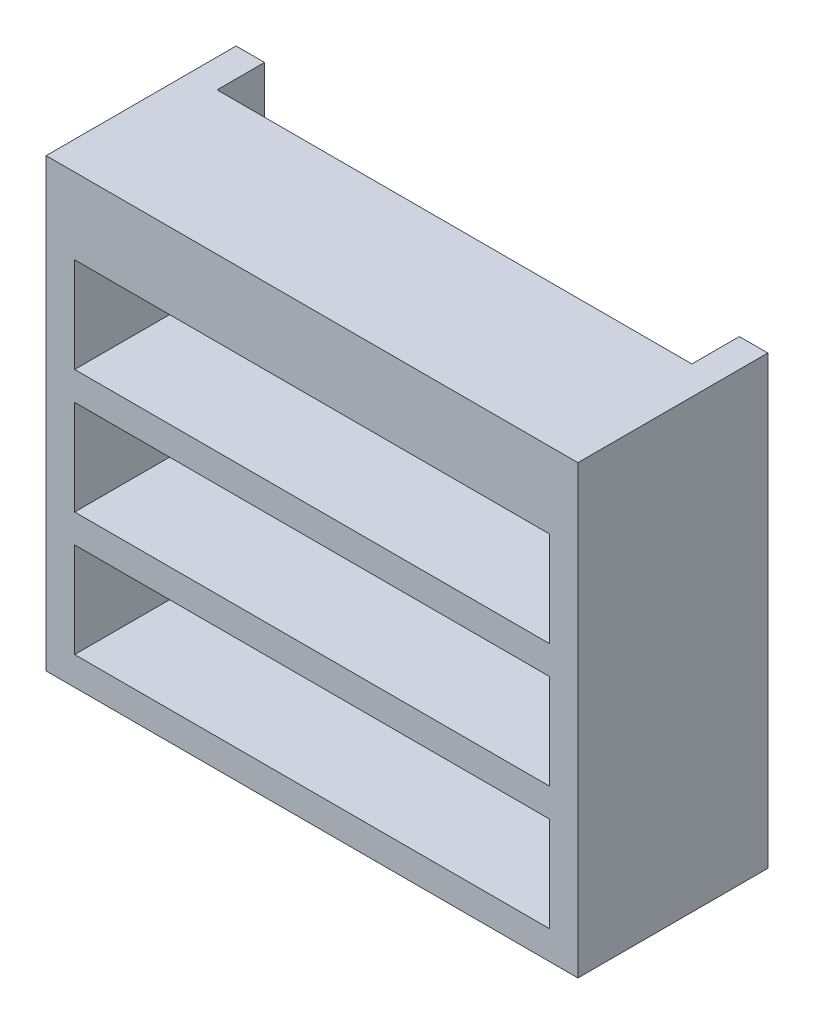
ISO-10303-21;
HEADER;
FILE_DESCRIPTION(('STEP AP214'),'2;1');
FILE_NAME('part.step','',(''),(''),'','','');
FILE_SCHEMA(('AUTOMOTIVE_DESIGN { 1 0 10303 214 1 1 1 1 }'));
ENDSEC;
DATA;
#1=APPLICATION_CONTEXT('core data for automotive mechanical design processes');
#2=APPLICATION_PROTOCOL_DEFINITION('international standard','automotive_design',2000,#1);
#3=PRODUCT_CONTEXT('',#1,'mechanical');
#4=PRODUCT('Part','Part','',(#3));
#5=PRODUCT_RELATED_PRODUCT_CATEGORY('part','',(#4));
#6=PRODUCT_DEFINITION_FORMATION('','',#4);
#7=PRODUCT_DEFINITION_CONTEXT('part definition',#1,'design');
#8=PRODUCT_DEFINITION('design','',#6,#7);
#9=PRODUCT_DEFINITION_SHAPE('','',#8);
#10=(LENGTH_UNIT() NAMED_UNIT(*) SI_UNIT(.MILLI.,.METRE.));
#11=(NAMED_UNIT(*) PLANE_ANGLE_UNIT() SI_UNIT($,.RADIAN.));
#12=(NAMED_UNIT(*) SI_UNIT($,.STERADIAN.) SOLID_ANGLE_UNIT());
#13=UNCERTAINTY_MEASURE_WITH_UNIT(LENGTH_MEASURE(1.E-05),#10,'distance_accuracy_value','');
#14=(GEOMETRIC_REPRESENTATION_CONTEXT(3) GLOBAL_UNCERTAINTY_ASSIGNED_CONTEXT((#13)) GLOBAL_UNIT_ASSIGNED_CONTEXT((#10,
#11,#12)) REPRESENTATION_CONTEXT('',''));
#15=CARTESIAN_POINT('',(0.,0.,0.));
#16=DIRECTION('',(0.,0.,1.));
#17=DIRECTION('',(1.,0.,0.));
#18=AXIS2_PLACEMENT_3D('',#15,#16,#17);
#19=CARTESIAN_POINT('',(0.,0.,0.));
#20=DIRECTION('',(0.,0.,1.));
#21=DIRECTION('',(1.,0.,0.));
#22=AXIS2_PLACEMENT_3D('',#19,#20,#21);
#23=PLANE('',#22);
#24=DIRECTION('',(0.,1.,0.));
#25=VECTOR('',#24,1.);
#26=CARTESIAN_POINT('',(20.8674304418985,18.5646898600385,0.));
#27=LINE('',#26,#25);
#28=CARTESIAN_POINT('',(20.8674304418985,-23.4353101399615,0.));
#29=VERTEX_POINT('',#28);
#30=CARTESIAN_POINT('',(20.8674304418985,-20.4353101399615,0.));
#31=VERTEX_POINT('',#30);
#32=EDGE_CURVE('E56',#29,#31,#27,.T.);
#33=ORIENTED_EDGE('',*,*,#32,.F.);
#34=DIRECTION('',(1.,0.,0.));
#35=VECTOR('',#34,1.);
#36=CARTESIAN_POINT('',(-29.1325695581015,-23.4353101399615,0.));
#37=LINE('',#36,#35);
#38=CARTESIAN_POINT('',(-29.1325695581015,-23.4353101399615,0.));
#39=VERTEX_POINT('',#38);
#40=EDGE_CURVE('E186',#39,#29,#37,.T.);
#41=ORIENTED_EDGE('',*,*,#40,.F.);
#42=DIRECTION('',(0.,-1.,0.));
#43=VECTOR('',#42,1.);
#44=CARTESIAN_POINT('',(-29.1325695581015,18.5646898600384,0.));
#45=LINE('',#44,#43);
#46=CARTESIAN_POINT('',(-29.1325695581015,-20.4353101399615,0.));
#47=VERTEX_POINT('',#46);
#48=EDGE_CURVE('E241',#47,#39,#45,.T.);
#49=ORIENTED_EDGE('',*,*,#48,.F.);
#50=DIRECTION('',(1.,0.,0.));
#51=VECTOR('',#50,1.);
#52=CARTESIAN_POINT('',(-29.1325695581015,-20.4353101399615,0.));
#53=LINE('',#52,#51);
#54=EDGE_CURVE('E248',#47,#31,#53,.T.);
#55=ORIENTED_EDGE('',*,*,#54,.T.);
#56=EDGE_LOOP('',(#33,#41,#49,#55));
#57=FACE_BOUND('',#56,.T.);
#58=ADVANCED_FACE('F38',(#57),#23,.F.);
#59=CARTESIAN_POINT('',(20.8674304418985,-10.4353101399615,0.));
#60=VERTEX_POINT('',#59);
#61=CARTESIAN_POINT('',(20.8674304418985,-7.43531013996155,0.));
#62=VERTEX_POINT('',#61);
#63=EDGE_CURVE('E229',#60,#62,#27,.T.);
#64=ORIENTED_EDGE('',*,*,#63,.F.);
#65=DIRECTION('',(-1.,0.,0.));
#66=VECTOR('',#65,1.);
#67=CARTESIAN_POINT('',(20.8674304418985,-10.4353101399615,0.));
#68=LINE('',#67,#66);
#69=CARTESIAN_POINT('',(-29.1325695581015,-10.4353101399615,0.));
#70=VERTEX_POINT('',#69);
#71=EDGE_CURVE('E244',#60,#70,#68,.T.);
#72=ORIENTED_EDGE('',*,*,#71,.T.);
#73=CARTESIAN_POINT('',(-29.1325695581015,-7.43531013996155,0.));
#74=VERTEX_POINT('',#73);
#75=EDGE_CURVE('E47',#74,#70,#45,.T.);
#76=ORIENTED_EDGE('',*,*,#75,.F.);
#77=DIRECTION('',(1.,0.,0.));
#78=VECTOR('',#77,1.);
#79=CARTESIAN_POINT('',(-29.1325695581015,-7.43531013996155,0.));
#80=LINE('',#79,#78);
#81=EDGE_CURVE('E269',#74,#62,#80,.T.);
#82=ORIENTED_EDGE('',*,*,#81,.T.);
#83=EDGE_LOOP('',(#64,#72,#76,#82));
#84=FACE_BOUND('',#83,.T.);
#85=ADVANCED_FACE('F334',(#84),#23,.F.);
#86=CARTESIAN_POINT('',(20.8674304418985,2.56468986003845,0.));
#87=VERTEX_POINT('',#86);
#88=CARTESIAN_POINT('',(20.8674304418985,5.56468986003845,0.));
#89=VERTEX_POINT('',#88);
#90=EDGE_CURVE('E384',#87,#89,#27,.T.);
#91=ORIENTED_EDGE('',*,*,#90,.F.);
#92=DIRECTION('',(-1.,0.,0.));
#93=VECTOR('',#92,1.);
#94=CARTESIAN_POINT('',(-29.1325695581015,2.56468986003845,0.));
#95=LINE('',#94,#93);
#96=CARTESIAN_POINT('',(-29.1325695581015,2.56468986003845,0.));
#97=VERTEX_POINT('',#96);
#98=EDGE_CURVE('E265',#87,#97,#95,.T.);
#99=ORIENTED_EDGE('',*,*,#98,.T.);
#100=CARTESIAN_POINT('',(-29.1325695581015,5.56468986003845,0.));
#101=VERTEX_POINT('',#100);
#102=EDGE_CURVE('E11',#101,#97,#45,.T.);
#103=ORIENTED_EDGE('',*,*,#102,.F.);
#104=DIRECTION('',(1.,0.,0.));
#105=VECTOR('',#104,1.);
#106=CARTESIAN_POINT('',(-29.1325695581015,5.56468986003845,0.));
#107=LINE('',#106,#105);
#108=EDGE_CURVE('E294',#101,#89,#107,.T.);
#109=ORIENTED_EDGE('',*,*,#108,.T.);
#110=EDGE_LOOP('',(#91,#99,#103,#109));
#111=FACE_BOUND('',#110,.T.);
#112=ADVANCED_FACE('F373',(#111),#23,.F.);
#113=CARTESIAN_POINT('',(20.8674304418985,15.5646898600384,0.));
#114=VERTEX_POINT('',#113);
#115=CARTESIAN_POINT('',(20.8674304418985,23.5646898600384,0.));
#116=VERTEX_POINT('',#115);
#117=EDGE_CURVE('E219',#114,#116,#27,.T.);
#118=ORIENTED_EDGE('',*,*,#117,.F.);
#119=DIRECTION('',(-1.,0.,0.));
#120=VECTOR('',#119,1.);
#121=CARTESIAN_POINT('',(20.8674304418985,15.5646898600384,0.));
#122=LINE('',#121,#120);
#123=CARTESIAN_POINT('',(-29.1325695581015,15.5646898600384,0.));
#124=VERTEX_POINT('',#123);
#125=EDGE_CURVE('E290',#114,#124,#122,.T.);
#126=ORIENTED_EDGE('',*,*,#125,.T.);
#127=CARTESIAN_POINT('',(-29.1325695581015,23.5646898600384,0.));
#128=VERTEX_POINT('',#127);
#129=EDGE_CURVE('E49',#128,#124,#45,.T.);
#130=ORIENTED_EDGE('',*,*,#129,.F.);
#131=DIRECTION('',(-1.,0.,0.));
#132=VECTOR('',#131,1.);
#133=CARTESIAN_POINT('',(23.8674304418985,23.5646898600384,0.));
#134=LINE('',#133,#132);
#135=EDGE_CURVE('E206',#116,#128,#134,.T.);
#136=ORIENTED_EDGE('',*,*,#135,.F.);
#137=EDGE_LOOP('',(#118,#126,#130,#136));
#138=FACE_BOUND('',#137,.T.);
#139=ADVANCED_FACE('F369',(#138),#23,.F.);
#140=CARTESIAN_POINT('',(0.,0.,15.));
#141=DIRECTION('',(0.,0.,1.));
#142=DIRECTION('',(1.,0.,0.));
#143=AXIS2_PLACEMENT_3D('',#140,#141,#142);
#144=PLANE('',#143);
#145=DIRECTION('',(0.,1.,0.));
#146=VECTOR('',#145,1.);
#147=CARTESIAN_POINT('',(23.8674304418985,-23.4353101399615,15.));
#148=LINE('',#147,#146);
#149=CARTESIAN_POINT('',(23.8674304418985,-23.4353101399615,15.));
#150=VERTEX_POINT('',#149);
#151=CARTESIAN_POINT('',(23.8674304418985,23.5646898600384,15.));
#152=VERTEX_POINT('',#151);
#153=EDGE_CURVE('E203',#150,#152,#148,.T.);
#154=ORIENTED_EDGE('',*,*,#153,.T.);
#155=DIRECTION('',(1.,0.,0.));
#156=VECTOR('',#155,1.);
#157=CARTESIAN_POINT('',(-32.1325695581015,23.5646898600384,15.));
#158=LINE('',#157,#156);
#159=CARTESIAN_POINT('',(-32.1325695581015,23.5646898600384,15.));
#160=VERTEX_POINT('',#159);
#161=EDGE_CURVE('E193',#160,#152,#158,.T.);
#162=ORIENTED_EDGE('',*,*,#161,.F.);
#163=DIRECTION('',(0.,-1.,0.));
#164=VECTOR('',#163,1.);
#165=CARTESIAN_POINT('',(-32.1325695581015,18.5646898600384,15.));
#166=LINE('',#165,#164);
#167=CARTESIAN_POINT('',(-32.1325695581015,-23.4353101399615,15.));
#168=VERTEX_POINT('',#167);
#169=EDGE_CURVE('E178',#160,#168,#166,.T.);
#170=ORIENTED_EDGE('',*,*,#169,.T.);
#171=DIRECTION('',(1.,0.,0.));
#172=VECTOR('',#171,1.);
#173=CARTESIAN_POINT('',(-32.1325695581015,-23.4353101399615,15.));
#174=LINE('',#173,#172);
#175=EDGE_CURVE('E185',#168,#150,#174,.T.);
#176=ORIENTED_EDGE('',*,*,#175,.T.);
#177=EDGE_LOOP('',(#154,#162,#170,#176));
#178=FACE_BOUND('',#177,.T.);
#179=DIRECTION('',(0.,-1.,0.));
#180=VECTOR('',#179,1.);
#181=CARTESIAN_POINT('',(-29.1325695581015,15.5646898600384,15.));
#182=LINE('',#181,#180);
#183=CARTESIAN_POINT('',(-29.1325695581015,15.5646898600384,15.));
#184=VERTEX_POINT('',#183);
#185=CARTESIAN_POINT('',(-29.1325695581015,5.56468986003845,15.));
#186=VERTEX_POINT('',#185);
#187=EDGE_CURVE('E293',#184,#186,#182,.T.);
#188=ORIENTED_EDGE('',*,*,#187,.F.);
#189=DIRECTION('',(-1.,0.,0.));
#190=VECTOR('',#189,1.);
#191=CARTESIAN_POINT('',(20.8674304418985,15.5646898600384,15.));
#192=LINE('',#191,#190);
#193=CARTESIAN_POINT('',(20.8674304418985,15.5646898600384,15.));
#194=VERTEX_POINT('',#193);
#195=EDGE_CURVE('E291',#194,#184,#192,.T.);
#196=ORIENTED_EDGE('',*,*,#195,.F.);
#197=DIRECTION('',(0.,1.,0.));
#198=VECTOR('',#197,1.);
#199=CARTESIAN_POINT('',(20.8674304418985,5.56468986003845,15.));
#200=LINE('',#199,#198);
#201=CARTESIAN_POINT('',(20.8674304418985,5.56468986003845,15.));
#202=VERTEX_POINT('',#201);
#203=EDGE_CURVE('E299',#202,#194,#200,.T.);
#204=ORIENTED_EDGE('',*,*,#203,.F.);
#205=DIRECTION('',(1.,0.,0.));
#206=VECTOR('',#205,1.);
#207=CARTESIAN_POINT('',(-29.1325695581015,5.56468986003845,15.));
#208=LINE('',#207,#206);
#209=EDGE_CURVE('E296',#186,#202,#208,.T.);
#210=ORIENTED_EDGE('',*,*,#209,.F.);
#211=EDGE_LOOP('',(#188,#196,#204,#210));
#212=FACE_BOUND('',#211,.T.);
#213=DIRECTION('',(0.,-1.,0.));
#214=VECTOR('',#213,1.);
#215=CARTESIAN_POINT('',(-29.1325695581015,2.56468986003845,15.));
#216=LINE('',#215,#214);
#217=CARTESIAN_POINT('',(-29.1325695581015,2.56468986003845,15.));
#218=VERTEX_POINT('',#217);
#219=CARTESIAN_POINT('',(-29.1325695581015,-7.43531013996155,15.));
#220=VERTEX_POINT('',#219);
#221=EDGE_CURVE('E268',#218,#220,#216,.T.);
#222=ORIENTED_EDGE('',*,*,#221,.F.);
#223=DIRECTION('',(-1.,0.,0.));
#224=VECTOR('',#223,1.);
#225=CARTESIAN_POINT('',(-29.1325695581015,2.56468986003845,15.));
#226=LINE('',#225,#224);
#227=CARTESIAN_POINT('',(20.8674304418985,2.56468986003845,15.));
#228=VERTEX_POINT('',#227);
#229=EDGE_CURVE('E266',#228,#218,#226,.T.);
#230=ORIENTED_EDGE('',*,*,#229,.F.);
#231=DIRECTION('',(0.,1.,0.));
#232=VECTOR('',#231,1.);
#233=CARTESIAN_POINT('',(20.8674304418985,-7.43531013996155,15.));
#234=LINE('',#233,#232);
#235=CARTESIAN_POINT('',(20.8674304418985,-7.43531013996155,15.));
#236=VERTEX_POINT('',#235);
#237=EDGE_CURVE('E274',#236,#228,#234,.T.);
#238=ORIENTED_EDGE('',*,*,#237,.F.);
#239=DIRECTION('',(1.,0.,0.));
#240=VECTOR('',#239,1.);
#241=CARTESIAN_POINT('',(-29.1325695581015,-7.43531013996155,15.));
#242=LINE('',#241,#240);
#243=EDGE_CURVE('E271',#220,#236,#242,.T.);
#244=ORIENTED_EDGE('',*,*,#243,.F.);
#245=EDGE_LOOP('',(#222,#230,#238,#244));
#246=FACE_BOUND('',#245,.T.);
#247=DIRECTION('',(0.,-1.,0.));
#248=VECTOR('',#247,1.);
#249=CARTESIAN_POINT('',(-29.1325695581015,-10.4353101399615,15.));
#250=LINE('',#249,#248);
#251=CARTESIAN_POINT('',(-29.1325695581015,-10.4353101399615,15.));
#252=VERTEX_POINT('',#251);
#253=CARTESIAN_POINT('',(-29.1325695581015,-20.4353101399615,15.));
#254=VERTEX_POINT('',#253);
#255=EDGE_CURVE('E247',#252,#254,#250,.T.);
#256=ORIENTED_EDGE('',*,*,#255,.F.);
#257=DIRECTION('',(-1.,0.,0.));
#258=VECTOR('',#257,1.);
#259=CARTESIAN_POINT('',(20.8674304418985,-10.4353101399615,15.));
#260=LINE('',#259,#258);
#261=CARTESIAN_POINT('',(20.8674304418985,-10.4353101399615,15.));
#262=VERTEX_POINT('',#261);
#263=EDGE_CURVE('E245',#262,#252,#260,.T.);
#264=ORIENTED_EDGE('',*,*,#263,.F.);
#265=DIRECTION('',(0.,1.,0.));
#266=VECTOR('',#265,1.);
#267=CARTESIAN_POINT('',(20.8674304418985,-20.4353101399615,15.));
#268=LINE('',#267,#266);
#269=CARTESIAN_POINT('',(20.8674304418985,-20.4353101399615,15.));
#270=VERTEX_POINT('',#269);
#271=EDGE_CURVE('E252',#270,#262,#268,.T.);
#272=ORIENTED_EDGE('',*,*,#271,.F.);
#273=DIRECTION('',(1.,0.,0.));
#274=VECTOR('',#273,1.);
#275=CARTESIAN_POINT('',(-29.1325695581015,-20.4353101399615,15.));
#276=LINE('',#275,#274);
#277=EDGE_CURVE('E250',#254,#270,#276,.T.);
#278=ORIENTED_EDGE('',*,*,#277,.F.);
#279=EDGE_LOOP('',(#256,#264,#272,#278));
#280=FACE_BOUND('',#279,.T.);
#281=ADVANCED_FACE('F200',(#178,#212,#246,#280),#144,.T.);
#282=CARTESIAN_POINT('',(-32.1325695581015,18.5646898600384,15.));
#283=DIRECTION('',(1.,0.,0.));
#284=DIRECTION('',(0.,1.,0.));
#285=AXIS2_PLACEMENT_3D('',#282,#283,#284);
#286=PLANE('',#285);
#287=ORIENTED_EDGE('',*,*,#169,.F.);
#288=DIRECTION('',(0.,0.,1.));
#289=VECTOR('',#288,1.);
#290=CARTESIAN_POINT('',(-32.1325695581015,23.5646898600384,-5.));
#291=LINE('',#290,#289);
#292=CARTESIAN_POINT('',(-32.1325695581015,23.5646898600384,-5.));
#293=VERTEX_POINT('',#292);
#294=EDGE_CURVE('E181',#293,#160,#291,.T.);
#295=ORIENTED_EDGE('',*,*,#294,.F.);
#296=DIRECTION('',(0.,1.,0.));
#297=VECTOR('',#296,1.);
#298=CARTESIAN_POINT('',(-32.1325695581015,18.5646898600384,-5.));
#299=LINE('',#298,#297);
#300=CARTESIAN_POINT('',(-32.1325695581015,-23.4353101399615,-5.));
#301=VERTEX_POINT('',#300);
#302=EDGE_CURVE('E232',#301,#293,#299,.T.);
#303=ORIENTED_EDGE('',*,*,#302,.F.);
#304=DIRECTION('',(0.,0.,-1.));
#305=VECTOR('',#304,1.);
#306=CARTESIAN_POINT('',(-32.1325695581015,-23.4353101399615,15.));
#307=LINE('',#306,#305);
#308=EDGE_CURVE('E42',#168,#301,#307,.T.);
#309=ORIENTED_EDGE('',*,*,#308,.F.);
#310=EDGE_LOOP('',(#287,#295,#303,#309));
#311=FACE_BOUND('',#310,.T.);
#312=ADVANCED_FACE('F40',(#311),#286,.F.);
#313=CARTESIAN_POINT('',(-29.1325695581015,-23.4353101399615,15.));
#314=DIRECTION('',(0.,1.,0.));
#315=DIRECTION('',(0.,0.,1.));
#316=AXIS2_PLACEMENT_3D('',#313,#314,#315);
#317=PLANE('',#316);
#318=ORIENTED_EDGE('',*,*,#308,.T.);
#319=DIRECTION('',(-1.,0.,0.));
#320=VECTOR('',#319,1.);
#321=CARTESIAN_POINT('',(-32.1325695581015,-23.4353101399615,-5.));
#322=LINE('',#321,#320);
#323=CARTESIAN_POINT('',(-29.1325695581015,-23.4353101399615,-5.));
#324=VERTEX_POINT('',#323);
#325=EDGE_CURVE('E236',#324,#301,#322,.T.);
#326=ORIENTED_EDGE('',*,*,#325,.F.);
#327=DIRECTION('',(0.,0.,1.));
#328=VECTOR('',#327,1.);
#329=CARTESIAN_POINT('',(-29.1325695581015,-23.4353101399615,-5.));
#330=LINE('',#329,#328);
#331=EDGE_CURVE('E238',#324,#39,#330,.T.);
#332=ORIENTED_EDGE('',*,*,#331,.T.);
#333=ORIENTED_EDGE('',*,*,#40,.T.);
#334=DIRECTION('',(0.,0.,1.));
#335=VECTOR('',#334,1.);
#336=CARTESIAN_POINT('',(20.8674304418985,-23.4353101399615,-5.));
#337=LINE('',#336,#335);
#338=CARTESIAN_POINT('',(20.8674304418985,-23.4353101399615,-5.));
#339=VERTEX_POINT('',#338);
#340=EDGE_CURVE('E227',#339,#29,#337,.T.);
#341=ORIENTED_EDGE('',*,*,#340,.F.);
#342=DIRECTION('',(-1.,0.,0.));
#343=VECTOR('',#342,1.);
#344=CARTESIAN_POINT('',(23.8674304418985,-23.4353101399615,-5.));
#345=LINE('',#344,#343);
#346=CARTESIAN_POINT('',(23.8674304418985,-23.4353101399615,-5.));
#347=VERTEX_POINT('',#346);
#348=EDGE_CURVE('E223',#347,#339,#345,.T.);
#349=ORIENTED_EDGE('',*,*,#348,.F.);
#350=DIRECTION('',(0.,0.,-1.));
#351=VECTOR('',#350,1.);
#352=CARTESIAN_POINT('',(23.8674304418985,-23.4353101399615,15.));
#353=LINE('',#352,#351);
#354=EDGE_CURVE('E317',#150,#347,#353,.T.);
#355=ORIENTED_EDGE('',*,*,#354,.F.);
#356=ORIENTED_EDGE('',*,*,#175,.F.);
#357=EDGE_LOOP('',(#318,#326,#332,#333,#341,#349,#355,#356));
#358=FACE_BOUND('',#357,.T.);
#359=ADVANCED_FACE('F352',(#358),#317,.F.);
#360=CARTESIAN_POINT('',(23.8674304418985,-23.4353101399615,15.));
#361=DIRECTION('',(-1.,0.,0.));
#362=DIRECTION('',(0.,0.,1.));
#363=AXIS2_PLACEMENT_3D('',#360,#361,#362);
#364=PLANE('',#363);
#365=ORIENTED_EDGE('',*,*,#354,.T.);
#366=DIRECTION('',(0.,-1.,0.));
#367=VECTOR('',#366,1.);
#368=CARTESIAN_POINT('',(23.8674304418985,18.5646898600385,-5.));
#369=LINE('',#368,#367);
#370=CARTESIAN_POINT('',(23.8674304418985,23.5646898600384,-5.));
#371=VERTEX_POINT('',#370);
#372=EDGE_CURVE('E220',#371,#347,#369,.T.);
#373=ORIENTED_EDGE('',*,*,#372,.F.);
#374=DIRECTION('',(0.,0.,-1.));
#375=VECTOR('',#374,1.);
#376=CARTESIAN_POINT('',(23.8674304418985,23.5646898600384,-5.));
#377=LINE('',#376,#375);
#378=EDGE_CURVE('E209',#152,#371,#377,.T.);
#379=ORIENTED_EDGE('',*,*,#378,.F.);
#380=ORIENTED_EDGE('',*,*,#153,.F.);
#381=EDGE_LOOP('',(#365,#373,#379,#380));
#382=FACE_BOUND('',#381,.T.);
#383=ADVANCED_FACE('F425',(#382),#364,.F.);
#384=CARTESIAN_POINT('',(20.8674304418985,15.5646898600384,15.));
#385=DIRECTION('',(0.,-1.,0.));
#386=DIRECTION('',(0.,0.,-1.));
#387=AXIS2_PLACEMENT_3D('',#384,#385,#386);
#388=PLANE('',#387);
#389=ORIENTED_EDGE('',*,*,#125,.F.);
#390=DIRECTION('',(0.,0.,-1.));
#391=VECTOR('',#390,1.);
#392=CARTESIAN_POINT('',(20.8674304418985,15.5646898600384,15.));
#393=LINE('',#392,#391);
#394=EDGE_CURVE('E301',#194,#114,#393,.T.);
#395=ORIENTED_EDGE('',*,*,#394,.F.);
#396=ORIENTED_EDGE('',*,*,#195,.T.);
#397=DIRECTION('',(0.,0.,-1.));
#398=VECTOR('',#397,1.);
#399=CARTESIAN_POINT('',(-29.1325695581015,15.5646898600384,15.));
#400=LINE('',#399,#398);
#401=EDGE_CURVE('E313',#184,#124,#400,.T.);
#402=ORIENTED_EDGE('',*,*,#401,.T.);
#403=EDGE_LOOP('',(#389,#395,#396,#402));
#404=FACE_BOUND('',#403,.T.);
#405=ADVANCED_FACE('F387',(#404),#388,.T.);
#406=CARTESIAN_POINT('',(-29.1325695581015,15.5646898600384,15.));
#407=DIRECTION('',(1.,0.,0.));
#408=DIRECTION('',(0.,1.,0.));
#409=AXIS2_PLACEMENT_3D('',#406,#407,#408);
#410=PLANE('',#409);
#411=DIRECTION('',(0.,0.,-1.));
#412=VECTOR('',#411,1.);
#413=CARTESIAN_POINT('',(-29.1325695581015,5.56468986003845,15.));
#414=LINE('',#413,#412);
#415=EDGE_CURVE('E310',#186,#101,#414,.T.);
#416=ORIENTED_EDGE('',*,*,#415,.T.);
#417=ORIENTED_EDGE('',*,*,#102,.T.);
#418=DIRECTION('',(0.,0.,-1.));
#419=VECTOR('',#418,1.);
#420=CARTESIAN_POINT('',(-29.1325695581015,2.56468986003845,15.));
#421=LINE('',#420,#419);
#422=EDGE_CURVE('E288',#218,#97,#421,.T.);
#423=ORIENTED_EDGE('',*,*,#422,.F.);
#424=ORIENTED_EDGE('',*,*,#221,.T.);
#425=DIRECTION('',(0.,0.,-1.));
#426=VECTOR('',#425,1.);
#427=CARTESIAN_POINT('',(-29.1325695581015,-7.43531013996155,15.));
#428=LINE('',#427,#426);
#429=EDGE_CURVE('E285',#220,#74,#428,.T.);
#430=ORIENTED_EDGE('',*,*,#429,.T.);
#431=ORIENTED_EDGE('',*,*,#75,.T.);
#432=DIRECTION('',(0.,0.,-1.));
#433=VECTOR('',#432,1.);
#434=CARTESIAN_POINT('',(-29.1325695581015,-10.4353101399615,15.));
#435=LINE('',#434,#433);
#436=EDGE_CURVE('E263',#252,#70,#435,.T.);
#437=ORIENTED_EDGE('',*,*,#436,.F.);
#438=ORIENTED_EDGE('',*,*,#255,.T.);
#439=DIRECTION('',(0.,0.,-1.));
#440=VECTOR('',#439,1.);
#441=CARTESIAN_POINT('',(-29.1325695581015,-20.4353101399615,15.));
#442=LINE('',#441,#440);
#443=EDGE_CURVE('E260',#254,#47,#442,.T.);
#444=ORIENTED_EDGE('',*,*,#443,.T.);
#445=ORIENTED_EDGE('',*,*,#48,.T.);
#446=ORIENTED_EDGE('',*,*,#331,.F.);
#447=DIRECTION('',(0.,-1.,0.));
#448=VECTOR('',#447,1.);
#449=CARTESIAN_POINT('',(-29.1325695581015,18.5646898600384,-5.));
#450=LINE('',#449,#448);
#451=CARTESIAN_POINT('',(-29.1325695581015,23.5646898600384,-5.));
#452=VERTEX_POINT('',#451);
#453=EDGE_CURVE('E234',#452,#324,#450,.T.);
#454=ORIENTED_EDGE('',*,*,#453,.F.);
#455=DIRECTION('',(0.,0.,-1.));
#456=VECTOR('',#455,1.);
#457=CARTESIAN_POINT('',(-29.1325695581015,23.5646898600384,-5.));
#458=LINE('',#457,#456);
#459=EDGE_CURVE('E197',#128,#452,#458,.T.);
#460=ORIENTED_EDGE('',*,*,#459,.F.);
#461=ORIENTED_EDGE('',*,*,#129,.T.);
#462=ORIENTED_EDGE('',*,*,#401,.F.);
#463=ORIENTED_EDGE('',*,*,#187,.T.);
#464=EDGE_LOOP('',(#416,#417,#423,#424,#430,#431,#437,#438,#444,#445,#446,#454,#460,#461,#462,#463));
#465=FACE_BOUND('',#464,.T.);
#466=ADVANCED_FACE('F328',(#465),#410,.T.);
#467=CARTESIAN_POINT('',(-29.1325695581015,5.56468986003845,15.));
#468=DIRECTION('',(0.,1.,0.));
#469=DIRECTION('',(0.,0.,1.));
#470=AXIS2_PLACEMENT_3D('',#467,#468,#469);
#471=PLANE('',#470);
#472=ORIENTED_EDGE('',*,*,#108,.F.);
#473=ORIENTED_EDGE('',*,*,#415,.F.);
#474=ORIENTED_EDGE('',*,*,#209,.T.);
#475=DIRECTION('',(0.,0.,-1.));
#476=VECTOR('',#475,1.);
#477=CARTESIAN_POINT('',(20.8674304418985,5.56468986003845,15.));
#478=LINE('',#477,#476);
#479=EDGE_CURVE('E308',#202,#89,#478,.T.);
#480=ORIENTED_EDGE('',*,*,#479,.T.);
#481=EDGE_LOOP('',(#472,#473,#474,#480));
#482=FACE_BOUND('',#481,.T.);
#483=ADVANCED_FACE('F398',(#482),#471,.T.);
#484=CARTESIAN_POINT('',(20.8674304418985,5.56468986003845,15.));
#485=DIRECTION('',(-1.,0.,0.));
#486=DIRECTION('',(0.,-1.,0.));
#487=AXIS2_PLACEMENT_3D('',#484,#485,#486);
#488=PLANE('',#487);
#489=ORIENTED_EDGE('',*,*,#394,.T.);
#490=ORIENTED_EDGE('',*,*,#117,.T.);
#491=DIRECTION('',(0.,0.,1.));
#492=VECTOR('',#491,1.);
#493=CARTESIAN_POINT('',(20.8674304418985,23.5646898600384,-5.));
#494=LINE('',#493,#492);
#495=CARTESIAN_POINT('',(20.8674304418985,23.5646898600384,-5.));
#496=VERTEX_POINT('',#495);
#497=EDGE_CURVE('E205',#496,#116,#494,.T.);
#498=ORIENTED_EDGE('',*,*,#497,.F.);
#499=DIRECTION('',(0.,1.,0.));
#500=VECTOR('',#499,1.);
#501=CARTESIAN_POINT('',(20.8674304418985,18.5646898600385,-5.));
#502=LINE('',#501,#500);
#503=EDGE_CURVE('E225',#339,#496,#502,.T.);
#504=ORIENTED_EDGE('',*,*,#503,.F.);
#505=ORIENTED_EDGE('',*,*,#340,.T.);
#506=ORIENTED_EDGE('',*,*,#32,.T.);
#507=DIRECTION('',(0.,0.,-1.));
#508=VECTOR('',#507,1.);
#509=CARTESIAN_POINT('',(20.8674304418985,-20.4353101399615,15.));
#510=LINE('',#509,#508);
#511=EDGE_CURVE('E63',#270,#31,#510,.T.);
#512=ORIENTED_EDGE('',*,*,#511,.F.);
#513=ORIENTED_EDGE('',*,*,#271,.T.);
#514=DIRECTION('',(0.,0.,-1.));
#515=VECTOR('',#514,1.);
#516=CARTESIAN_POINT('',(20.8674304418985,-10.4353101399615,15.));
#517=LINE('',#516,#515);
#518=EDGE_CURVE('E254',#262,#60,#517,.T.);
#519=ORIENTED_EDGE('',*,*,#518,.T.);
#520=ORIENTED_EDGE('',*,*,#63,.T.);
#521=DIRECTION('',(0.,0.,-1.));
#522=VECTOR('',#521,1.);
#523=CARTESIAN_POINT('',(20.8674304418985,-7.43531013996155,15.));
#524=LINE('',#523,#522);
#525=EDGE_CURVE('E283',#236,#62,#524,.T.);
#526=ORIENTED_EDGE('',*,*,#525,.F.);
#527=ORIENTED_EDGE('',*,*,#237,.T.);
#528=DIRECTION('',(0.,0.,-1.));
#529=VECTOR('',#528,1.);
#530=CARTESIAN_POINT('',(20.8674304418985,2.56468986003845,15.));
#531=LINE('',#530,#529);
#532=EDGE_CURVE('E276',#228,#87,#531,.T.);
#533=ORIENTED_EDGE('',*,*,#532,.T.);
#534=ORIENTED_EDGE('',*,*,#90,.T.);
#535=ORIENTED_EDGE('',*,*,#479,.F.);
#536=ORIENTED_EDGE('',*,*,#203,.T.);
#537=EDGE_LOOP('',(#489,#490,#498,#504,#505,#506,#512,#513,#519,#520,#526,#527,#533,#534,#535,#536));
#538=FACE_BOUND('',#537,.T.);
#539=ADVANCED_FACE('F348',(#538),#488,.T.);
#540=CARTESIAN_POINT('',(-29.1325695581015,2.56468986003845,15.));
#541=DIRECTION('',(0.,-1.,0.));
#542=DIRECTION('',(0.,0.,-1.));
#543=AXIS2_PLACEMENT_3D('',#540,#541,#542);
#544=PLANE('',#543);
#545=ORIENTED_EDGE('',*,*,#98,.F.);
#546=ORIENTED_EDGE('',*,*,#532,.F.);
#547=ORIENTED_EDGE('',*,*,#229,.T.);
#548=ORIENTED_EDGE('',*,*,#422,.T.);
#549=EDGE_LOOP('',(#545,#546,#547,#548));
#550=FACE_BOUND('',#549,.T.);
#551=ADVANCED_FACE('F409',(#550),#544,.T.);
#552=CARTESIAN_POINT('',(-29.1325695581015,-7.43531013996155,15.));
#553=DIRECTION('',(0.,1.,0.));
#554=DIRECTION('',(0.,0.,1.));
#555=AXIS2_PLACEMENT_3D('',#552,#553,#554);
#556=PLANE('',#555);
#557=ORIENTED_EDGE('',*,*,#81,.F.);
#558=ORIENTED_EDGE('',*,*,#429,.F.);
#559=ORIENTED_EDGE('',*,*,#243,.T.);
#560=ORIENTED_EDGE('',*,*,#525,.T.);
#561=EDGE_LOOP('',(#557,#558,#559,#560));
#562=FACE_BOUND('',#561,.T.);
#563=ADVANCED_FACE('F404',(#562),#556,.T.);
#564=CARTESIAN_POINT('',(20.8674304418985,-10.4353101399615,15.));
#565=DIRECTION('',(0.,-1.,0.));
#566=DIRECTION('',(0.,0.,-1.));
#567=AXIS2_PLACEMENT_3D('',#564,#565,#566);
#568=PLANE('',#567);
#569=ORIENTED_EDGE('',*,*,#71,.F.);
#570=ORIENTED_EDGE('',*,*,#518,.F.);
#571=ORIENTED_EDGE('',*,*,#263,.T.);
#572=ORIENTED_EDGE('',*,*,#436,.T.);
#573=EDGE_LOOP('',(#569,#570,#571,#572));
#574=FACE_BOUND('',#573,.T.);
#575=ADVANCED_FACE('F339',(#574),#568,.T.);
#576=CARTESIAN_POINT('',(-29.1325695581015,-20.4353101399615,15.));
#577=DIRECTION('',(0.,1.,0.));
#578=DIRECTION('',(0.,0.,1.));
#579=AXIS2_PLACEMENT_3D('',#576,#577,#578);
#580=PLANE('',#579);
#581=ORIENTED_EDGE('',*,*,#54,.F.);
#582=ORIENTED_EDGE('',*,*,#443,.F.);
#583=ORIENTED_EDGE('',*,*,#277,.T.);
#584=ORIENTED_EDGE('',*,*,#511,.T.);
#585=EDGE_LOOP('',(#581,#582,#583,#584));
#586=FACE_BOUND('',#585,.T.);
#587=ADVANCED_FACE('F347',(#586),#580,.T.);
#588=CARTESIAN_POINT('',(0.,0.,-5.));
#589=DIRECTION('',(0.,0.,1.));
#590=DIRECTION('',(1.,0.,0.));
#591=AXIS2_PLACEMENT_3D('',#588,#589,#590);
#592=PLANE('',#591);
#593=ORIENTED_EDGE('',*,*,#302,.T.);
#594=DIRECTION('',(-1.,0.,0.));
#595=VECTOR('',#594,1.);
#596=CARTESIAN_POINT('',(-32.1325695581015,23.5646898600384,-5.));
#597=LINE('',#596,#595);
#598=EDGE_CURVE('E196',#452,#293,#597,.T.);
#599=ORIENTED_EDGE('',*,*,#598,.F.);
#600=ORIENTED_EDGE('',*,*,#453,.T.);
#601=ORIENTED_EDGE('',*,*,#325,.T.);
#602=EDGE_LOOP('',(#593,#599,#600,#601));
#603=FACE_BOUND('',#602,.T.);
#604=ADVANCED_FACE('F356',(#603),#592,.F.);
#605=CARTESIAN_POINT('',(0.,0.,-5.));
#606=DIRECTION('',(0.,0.,-1.));
#607=DIRECTION('',(-1.,0.,0.));
#608=AXIS2_PLACEMENT_3D('',#605,#606,#607);
#609=PLANE('',#608);
#610=ORIENTED_EDGE('',*,*,#372,.T.);
#611=ORIENTED_EDGE('',*,*,#348,.T.);
#612=ORIENTED_EDGE('',*,*,#503,.T.);
#613=DIRECTION('',(-1.,0.,0.));
#614=VECTOR('',#613,1.);
#615=CARTESIAN_POINT('',(20.8674304418985,23.5646898600384,-5.));
#616=LINE('',#615,#614);
#617=EDGE_CURVE('E198',#371,#496,#616,.T.);
#618=ORIENTED_EDGE('',*,*,#617,.F.);
#619=EDGE_LOOP('',(#610,#611,#612,#618));
#620=FACE_BOUND('',#619,.T.);
#621=ADVANCED_FACE('F358',(#620),#609,.T.);
#622=CARTESIAN_POINT('',(0.,23.5646898600384,0.));
#623=DIRECTION('',(0.,1.,0.));
#624=DIRECTION('',(0.,0.,1.));
#625=AXIS2_PLACEMENT_3D('',#622,#623,#624);
#626=PLANE('',#625);
#627=ORIENTED_EDGE('',*,*,#294,.T.);
#628=ORIENTED_EDGE('',*,*,#161,.T.);
#629=ORIENTED_EDGE('',*,*,#378,.T.);
#630=ORIENTED_EDGE('',*,*,#617,.T.);
#631=ORIENTED_EDGE('',*,*,#497,.T.);
#632=ORIENTED_EDGE('',*,*,#135,.T.);
#633=ORIENTED_EDGE('',*,*,#459,.T.);
#634=ORIENTED_EDGE('',*,*,#598,.T.);
#635=EDGE_LOOP('',(#627,#628,#629,#630,#631,#632,#633,#634));
#636=FACE_BOUND('',#635,.T.);
#637=ADVANCED_FACE('F191',(#636),#626,.T.);
#638=CLOSED_SHELL('',(#58,#85,#112,#139,#281,#312,#359,#383,#405,#466,#483,#539,#551,#563,#575,
#587,#604,#621,#637));
#639=MANIFOLD_SOLID_BREP('B2',#638);
#640=ADVANCED_BREP_SHAPE_REPRESENTATION('',(#18,#639),#14);
#641=SHAPE_DEFINITION_REPRESENTATION(#9,#640);
ENDSEC;
END-ISO-10303-21;
